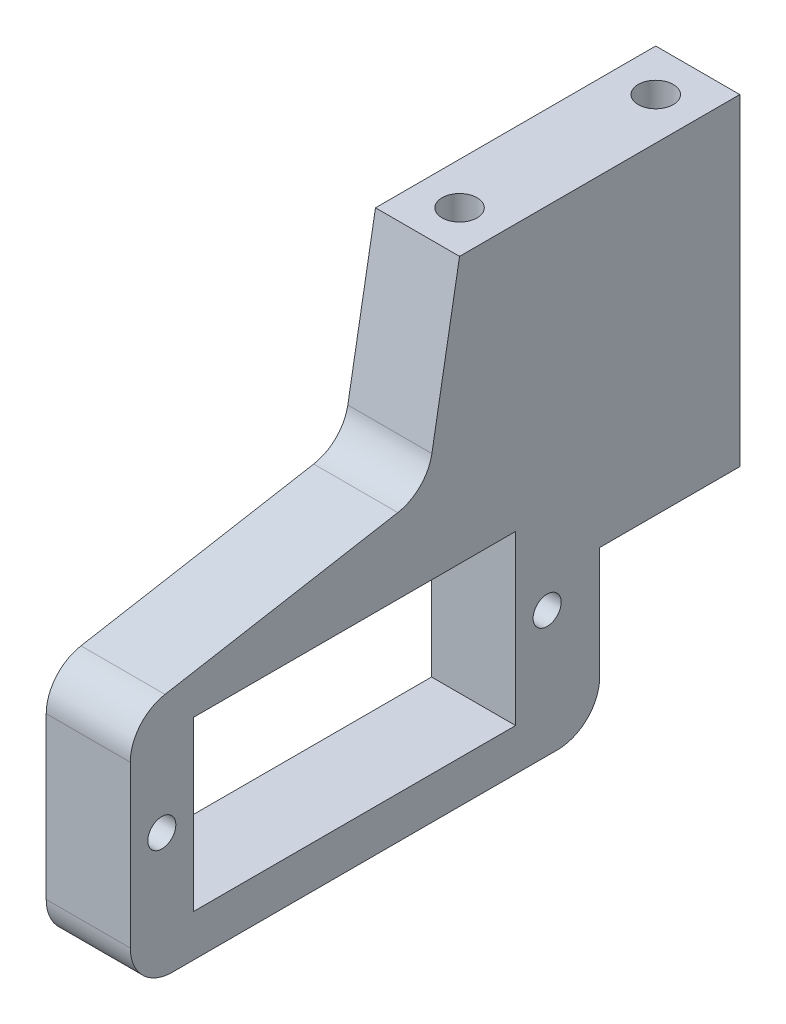
ISO-10303-21;
HEADER;
FILE_DESCRIPTION(('STEP AP214'),'2;1');
FILE_NAME('part.step','',(''),(''),'','','');
FILE_SCHEMA(('AUTOMOTIVE_DESIGN { 1 0 10303 214 1 1 1 1 }'));
ENDSEC;
DATA;
#1=APPLICATION_CONTEXT('core data for automotive mechanical design processes');
#2=APPLICATION_PROTOCOL_DEFINITION('international standard','automotive_design',2000,#1);
#3=PRODUCT_CONTEXT('',#1,'mechanical');
#4=PRODUCT('Part','Part','',(#3));
#5=PRODUCT_RELATED_PRODUCT_CATEGORY('part','',(#4));
#6=PRODUCT_DEFINITION_FORMATION('','',#4);
#7=PRODUCT_DEFINITION_CONTEXT('part definition',#1,'design');
#8=PRODUCT_DEFINITION('design','',#6,#7);
#9=PRODUCT_DEFINITION_SHAPE('','',#8);
#10=(LENGTH_UNIT() NAMED_UNIT(*) SI_UNIT(.MILLI.,.METRE.));
#11=(NAMED_UNIT(*) PLANE_ANGLE_UNIT() SI_UNIT($,.RADIAN.));
#12=(NAMED_UNIT(*) SI_UNIT($,.STERADIAN.) SOLID_ANGLE_UNIT());
#13=UNCERTAINTY_MEASURE_WITH_UNIT(LENGTH_MEASURE(1.E-05),#10,'distance_accuracy_value','');
#14=(GEOMETRIC_REPRESENTATION_CONTEXT(3) GLOBAL_UNCERTAINTY_ASSIGNED_CONTEXT((#13)) GLOBAL_UNIT_ASSIGNED_CONTEXT((#10,
#11,#12)) REPRESENTATION_CONTEXT('',''));
#15=CARTESIAN_POINT('',(0.,0.,0.));
#16=DIRECTION('',(0.,0.,1.));
#17=DIRECTION('',(1.,0.,0.));
#18=AXIS2_PLACEMENT_3D('',#15,#16,#17);
#19=CARTESIAN_POINT('',(6.,0.,0.));
#20=DIRECTION('',(1.,0.,0.));
#21=DIRECTION('',(0.,0.,-1.));
#22=AXIS2_PLACEMENT_3D('',#19,#20,#21);
#23=PLANE('',#22);
#24=DIRECTION('',(0.,0.,-1.));
#25=VECTOR('',#24,1.);
#26=CARTESIAN_POINT('',(6.,-34.,43.5));
#27=LINE('',#26,#25);
#28=CARTESIAN_POINT('',(6.,-34.,40.5));
#29=VERTEX_POINT('',#28);
#30=CARTESIAN_POINT('',(6.,-34.,13.));
#31=VERTEX_POINT('',#30);
#32=EDGE_CURVE('E251',#29,#31,#27,.T.);
#33=ORIENTED_EDGE('',*,*,#32,.T.);
#34=CARTESIAN_POINT('',(6.,-31.,13.));
#35=DIRECTION('',(1.,0.,0.));
#36=DIRECTION('',(0.,0.,-1.));
#37=AXIS2_PLACEMENT_3D('',#34,#35,#36);
#38=CIRCLE('',#37,3.);
#39=CARTESIAN_POINT('',(6.,-31.,10.));
#40=VERTEX_POINT('',#39);
#41=EDGE_CURVE('E300',#31,#40,#38,.T.);
#42=ORIENTED_EDGE('',*,*,#41,.T.);
#43=DIRECTION('',(0.,1.,0.));
#44=VECTOR('',#43,1.);
#45=CARTESIAN_POINT('',(6.,-34.,10.));
#46=LINE('',#45,#44);
#47=CARTESIAN_POINT('',(6.,-23.,10.));
#48=VERTEX_POINT('',#47);
#49=EDGE_CURVE('E181',#40,#48,#46,.T.);
#50=ORIENTED_EDGE('',*,*,#49,.T.);
#51=DIRECTION('',(0.,0.,-1.));
#52=VECTOR('',#51,1.);
#53=CARTESIAN_POINT('',(6.,-23.,0.));
#54=LINE('',#53,#52);
#55=CARTESIAN_POINT('',(6.,-23.,0.));
#56=VERTEX_POINT('',#55);
#57=EDGE_CURVE('E183',#48,#56,#54,.T.);
#58=ORIENTED_EDGE('',*,*,#57,.T.);
#59=DIRECTION('',(0.,1.,0.));
#60=VECTOR('',#59,1.);
#61=CARTESIAN_POINT('',(6.,-34.,0.));
#62=LINE('',#61,#60);
#63=CARTESIAN_POINT('',(6.,0.,0.));
#64=VERTEX_POINT('',#63);
#65=EDGE_CURVE('E254',#56,#64,#62,.T.);
#66=ORIENTED_EDGE('',*,*,#65,.T.);
#67=DIRECTION('',(0.,0.,1.));
#68=VECTOR('',#67,1.);
#69=CARTESIAN_POINT('',(6.,0.,0.));
#70=LINE('',#69,#68);
#71=CARTESIAN_POINT('',(6.,0.,20.));
#72=VERTEX_POINT('',#71);
#73=EDGE_CURVE('E240',#64,#72,#70,.T.);
#74=ORIENTED_EDGE('',*,*,#73,.T.);
#75=DIRECTION('',(0.,-0.984807753012209,0.173648177666926));
#76=VECTOR('',#75,1.);
#77=CARTESIAN_POINT('',(6.,0.,20.));
#78=LINE('',#77,#76);
#79=CARTESIAN_POINT('',(6.,-11.2001513763779,21.9748888756744));
#80=VERTEX_POINT('',#79);
#81=EDGE_CURVE('E243',#72,#80,#78,.T.);
#82=ORIENTED_EDGE('',*,*,#81,.T.);
#83=CARTESIAN_POINT('',(6.,-10.6792068433771,24.9293121347111));
#84=DIRECTION('',(1.,0.,0.));
#85=DIRECTION('',(0.,0.,-1.));
#86=AXIS2_PLACEMENT_3D('',#83,#84,#85);
#87=CIRCLE('',#86,3.);
#88=CARTESIAN_POINT('',(6.,-13.6336301024137,24.4083676017103));
#89=VERTEX_POINT('',#88);
#90=EDGE_CURVE('E11',#80,#89,#87,.F.);
#91=ORIENTED_EDGE('',*,*,#90,.T.);
#92=DIRECTION('',(0.,-0.173648177666927,0.984807753012209));
#93=VECTOR('',#92,1.);
#94=CARTESIAN_POINT('',(6.,-13.2688608134174,22.3396581646707));
#95=LINE('',#94,#93);
#96=CARTESIAN_POINT('',(6.,-16.5628756344952,41.0209445330008));
#97=VERTEX_POINT('',#96);
#98=EDGE_CURVE('E247',#89,#97,#95,.T.);
#99=ORIENTED_EDGE('',*,*,#98,.T.);
#100=CARTESIAN_POINT('',(6.,-19.5172988935318,40.5));
#101=DIRECTION('',(1.,0.,0.));
#102=DIRECTION('',(0.,0.,-1.));
#103=AXIS2_PLACEMENT_3D('',#100,#101,#102);
#104=CIRCLE('',#103,3.);
#105=CARTESIAN_POINT('',(6.,-19.5172988935318,43.5));
#106=VERTEX_POINT('',#105);
#107=EDGE_CURVE('E55',#97,#106,#104,.T.);
#108=ORIENTED_EDGE('',*,*,#107,.T.);
#109=DIRECTION('',(0.,-1.,0.));
#110=VECTOR('',#109,1.);
#111=CARTESIAN_POINT('',(6.,-17.,43.5));
#112=LINE('',#111,#110);
#113=CARTESIAN_POINT('',(6.,-31.,43.5));
#114=VERTEX_POINT('',#113);
#115=EDGE_CURVE('E249',#106,#114,#112,.T.);
#116=ORIENTED_EDGE('',*,*,#115,.T.);
#117=CARTESIAN_POINT('',(6.,-31.,40.5));
#118=DIRECTION('',(1.,0.,0.));
#119=DIRECTION('',(0.,0.,-1.));
#120=AXIS2_PLACEMENT_3D('',#117,#118,#119);
#121=CIRCLE('',#120,3.);
#122=EDGE_CURVE('E298',#114,#29,#121,.T.);
#123=ORIENTED_EDGE('',*,*,#122,.T.);
#124=EDGE_LOOP('',(#33,#42,#50,#58,#66,#74,#82,#91,#99,#108,#116,#123));
#125=FACE_BOUND('',#124,.T.);
#126=CARTESIAN_POINT('',(6.,-25.,13.75));
#127=DIRECTION('',(1.,0.,0.));
#128=DIRECTION('',(0.,0.,1.));
#129=AXIS2_PLACEMENT_3D('',#126,#127,#128);
#130=CIRCLE('',#129,1.);
#131=CARTESIAN_POINT('',(6.,-25.,14.75));
#132=VERTEX_POINT('',#131);
#133=EDGE_CURVE('E228',#132,#132,#130,.T.);
#134=ORIENTED_EDGE('',*,*,#133,.F.);
#135=EDGE_LOOP('',(#134));
#136=FACE_BOUND('',#135,.T.);
#137=CARTESIAN_POINT('',(6.,-25.,41.25));
#138=DIRECTION('',(1.,0.,0.));
#139=DIRECTION('',(0.,0.,1.));
#140=AXIS2_PLACEMENT_3D('',#137,#138,#139);
#141=CIRCLE('',#140,0.999999999999998);
#142=CARTESIAN_POINT('',(6.,-25.,42.25));
#143=VERTEX_POINT('',#142);
#144=EDGE_CURVE('E234',#143,#143,#141,.T.);
#145=ORIENTED_EDGE('',*,*,#144,.F.);
#146=EDGE_LOOP('',(#145));
#147=FACE_BOUND('',#146,.T.);
#148=DIRECTION('',(0.,0.,1.));
#149=VECTOR('',#148,1.);
#150=CARTESIAN_POINT('',(6.,-19.,39.));
#151=LINE('',#150,#149);
#152=CARTESIAN_POINT('',(6.,-19.,16.));
#153=VERTEX_POINT('',#152);
#154=CARTESIAN_POINT('',(6.,-19.,39.));
#155=VERTEX_POINT('',#154);
#156=EDGE_CURVE('E199',#153,#155,#151,.T.);
#157=ORIENTED_EDGE('',*,*,#156,.F.);
#158=DIRECTION('',(0.,1.,0.));
#159=VECTOR('',#158,1.);
#160=CARTESIAN_POINT('',(6.,-19.,16.));
#161=LINE('',#160,#159);
#162=CARTESIAN_POINT('',(6.,-31.,16.));
#163=VERTEX_POINT('',#162);
#164=EDGE_CURVE('E197',#163,#153,#161,.T.);
#165=ORIENTED_EDGE('',*,*,#164,.F.);
#166=DIRECTION('',(0.,0.,-1.));
#167=VECTOR('',#166,1.);
#168=CARTESIAN_POINT('',(6.,-31.,16.));
#169=LINE('',#168,#167);
#170=CARTESIAN_POINT('',(6.,-31.,39.));
#171=VERTEX_POINT('',#170);
#172=EDGE_CURVE('E205',#171,#163,#169,.T.);
#173=ORIENTED_EDGE('',*,*,#172,.F.);
#174=DIRECTION('',(0.,-1.,0.));
#175=VECTOR('',#174,1.);
#176=CARTESIAN_POINT('',(6.,-31.,39.));
#177=LINE('',#176,#175);
#178=EDGE_CURVE('E202',#155,#171,#177,.T.);
#179=ORIENTED_EDGE('',*,*,#178,.F.);
#180=EDGE_LOOP('',(#157,#165,#173,#179));
#181=FACE_BOUND('',#180,.T.);
#182=ADVANCED_FACE('F33',(#125,#136,#147,#181),#23,.T.);
#183=CARTESIAN_POINT('',(0.,0.,0.));
#184=DIRECTION('',(1.,0.,0.));
#185=DIRECTION('',(0.,0.,-1.));
#186=AXIS2_PLACEMENT_3D('',#183,#184,#185);
#187=PLANE('',#186);
#188=CARTESIAN_POINT('',(0.,-25.,13.75));
#189=DIRECTION('',(1.,0.,0.));
#190=DIRECTION('',(0.,0.,1.));
#191=AXIS2_PLACEMENT_3D('',#188,#189,#190);
#192=CIRCLE('',#191,1.);
#193=CARTESIAN_POINT('',(0.,-25.,14.75));
#194=VERTEX_POINT('',#193);
#195=EDGE_CURVE('E227',#194,#194,#192,.T.);
#196=ORIENTED_EDGE('',*,*,#195,.T.);
#197=EDGE_LOOP('',(#196));
#198=FACE_BOUND('',#197,.T.);
#199=DIRECTION('',(0.,1.,0.));
#200=VECTOR('',#199,1.);
#201=CARTESIAN_POINT('',(0.,-34.,10.));
#202=LINE('',#201,#200);
#203=CARTESIAN_POINT('',(0.,-31.,10.));
#204=VERTEX_POINT('',#203);
#205=CARTESIAN_POINT('',(0.,-23.,10.));
#206=VERTEX_POINT('',#205);
#207=EDGE_CURVE('E186',#204,#206,#202,.T.);
#208=ORIENTED_EDGE('',*,*,#207,.F.);
#209=CARTESIAN_POINT('',(0.,-31.,13.));
#210=DIRECTION('',(1.,0.,0.));
#211=DIRECTION('',(0.,0.,-1.));
#212=AXIS2_PLACEMENT_3D('',#209,#210,#211);
#213=CIRCLE('',#212,3.);
#214=CARTESIAN_POINT('',(0.,-34.,13.));
#215=VERTEX_POINT('',#214);
#216=EDGE_CURVE('E290',#204,#215,#213,.F.);
#217=ORIENTED_EDGE('',*,*,#216,.T.);
#218=DIRECTION('',(0.,0.,-1.));
#219=VECTOR('',#218,1.);
#220=CARTESIAN_POINT('',(0.,-34.,43.5));
#221=LINE('',#220,#219);
#222=CARTESIAN_POINT('',(0.,-34.,40.5));
#223=VERTEX_POINT('',#222);
#224=EDGE_CURVE('E267',#223,#215,#221,.T.);
#225=ORIENTED_EDGE('',*,*,#224,.F.);
#226=CARTESIAN_POINT('',(0.,-31.,40.5));
#227=DIRECTION('',(1.,0.,0.));
#228=DIRECTION('',(0.,0.,-1.));
#229=AXIS2_PLACEMENT_3D('',#226,#227,#228);
#230=CIRCLE('',#229,3.);
#231=CARTESIAN_POINT('',(0.,-31.,43.5));
#232=VERTEX_POINT('',#231);
#233=EDGE_CURVE('E288',#223,#232,#230,.F.);
#234=ORIENTED_EDGE('',*,*,#233,.T.);
#235=DIRECTION('',(0.,-1.,0.));
#236=VECTOR('',#235,1.);
#237=CARTESIAN_POINT('',(0.,-17.,43.5));
#238=LINE('',#237,#236);
#239=CARTESIAN_POINT('',(0.,-19.5172988935318,43.5));
#240=VERTEX_POINT('',#239);
#241=EDGE_CURVE('E265',#240,#232,#238,.T.);
#242=ORIENTED_EDGE('',*,*,#241,.F.);
#243=CARTESIAN_POINT('',(0.,-19.5172988935318,40.5));
#244=DIRECTION('',(1.,0.,0.));
#245=DIRECTION('',(0.,0.,-1.));
#246=AXIS2_PLACEMENT_3D('',#243,#244,#245);
#247=CIRCLE('',#246,3.);
#248=CARTESIAN_POINT('',(0.,-16.5628756344952,41.0209445330008));
#249=VERTEX_POINT('',#248);
#250=EDGE_CURVE('E286',#240,#249,#247,.F.);
#251=ORIENTED_EDGE('',*,*,#250,.T.);
#252=DIRECTION('',(0.,-0.173648177666927,0.984807753012209));
#253=VECTOR('',#252,1.);
#254=CARTESIAN_POINT('',(0.,-13.2688608134174,22.3396581646707));
#255=LINE('',#254,#253);
#256=CARTESIAN_POINT('',(0.,-13.6336301024137,24.4083676017103));
#257=VERTEX_POINT('',#256);
#258=EDGE_CURVE('E262',#257,#249,#255,.T.);
#259=ORIENTED_EDGE('',*,*,#258,.F.);
#260=CARTESIAN_POINT('',(0.,-10.6792068433771,24.9293121347111));
#261=DIRECTION('',(1.,0.,0.));
#262=DIRECTION('',(0.,0.,-1.));
#263=AXIS2_PLACEMENT_3D('',#260,#261,#262);
#264=CIRCLE('',#263,3.);
#265=CARTESIAN_POINT('',(0.,-11.2001513763779,21.9748888756744));
#266=VERTEX_POINT('',#265);
#267=EDGE_CURVE('E41',#257,#266,#264,.T.);
#268=ORIENTED_EDGE('',*,*,#267,.T.);
#269=DIRECTION('',(0.,-0.984807753012209,0.173648177666926));
#270=VECTOR('',#269,1.);
#271=CARTESIAN_POINT('',(0.,0.,20.));
#272=LINE('',#271,#270);
#273=CARTESIAN_POINT('',(0.,0.,20.));
#274=VERTEX_POINT('',#273);
#275=EDGE_CURVE('E259',#274,#266,#272,.T.);
#276=ORIENTED_EDGE('',*,*,#275,.F.);
#277=DIRECTION('',(0.,0.,1.));
#278=VECTOR('',#277,1.);
#279=CARTESIAN_POINT('',(0.,0.,0.));
#280=LINE('',#279,#278);
#281=CARTESIAN_POINT('',(0.,0.,0.));
#282=VERTEX_POINT('',#281);
#283=EDGE_CURVE('E237',#282,#274,#280,.T.);
#284=ORIENTED_EDGE('',*,*,#283,.F.);
#285=DIRECTION('',(0.,1.,0.));
#286=VECTOR('',#285,1.);
#287=CARTESIAN_POINT('',(0.,-34.,0.));
#288=LINE('',#287,#286);
#289=CARTESIAN_POINT('',(0.,-23.,0.));
#290=VERTEX_POINT('',#289);
#291=EDGE_CURVE('E244',#290,#282,#288,.T.);
#292=ORIENTED_EDGE('',*,*,#291,.F.);
#293=DIRECTION('',(0.,0.,-1.));
#294=VECTOR('',#293,1.);
#295=CARTESIAN_POINT('',(0.,-23.,0.));
#296=LINE('',#295,#294);
#297=EDGE_CURVE('E188',#206,#290,#296,.T.);
#298=ORIENTED_EDGE('',*,*,#297,.F.);
#299=EDGE_LOOP('',(#208,#217,#225,#234,#242,#251,#259,#268,#276,#284,#292,#298));
#300=FACE_BOUND('',#299,.T.);
#301=CARTESIAN_POINT('',(0.,-25.,41.25));
#302=DIRECTION('',(1.,0.,0.));
#303=DIRECTION('',(0.,0.,1.));
#304=AXIS2_PLACEMENT_3D('',#301,#302,#303);
#305=CIRCLE('',#304,0.999999999999998);
#306=CARTESIAN_POINT('',(0.,-25.,42.25));
#307=VERTEX_POINT('',#306);
#308=EDGE_CURVE('E231',#307,#307,#305,.T.);
#309=ORIENTED_EDGE('',*,*,#308,.T.);
#310=EDGE_LOOP('',(#309));
#311=FACE_BOUND('',#310,.T.);
#312=DIRECTION('',(0.,1.,0.));
#313=VECTOR('',#312,1.);
#314=CARTESIAN_POINT('',(0.,-19.,16.));
#315=LINE('',#314,#313);
#316=CARTESIAN_POINT('',(0.,-31.,16.));
#317=VERTEX_POINT('',#316);
#318=CARTESIAN_POINT('',(0.,-19.,16.));
#319=VERTEX_POINT('',#318);
#320=EDGE_CURVE('E194',#317,#319,#315,.T.);
#321=ORIENTED_EDGE('',*,*,#320,.T.);
#322=DIRECTION('',(0.,0.,1.));
#323=VECTOR('',#322,1.);
#324=CARTESIAN_POINT('',(0.,-19.,39.));
#325=LINE('',#324,#323);
#326=CARTESIAN_POINT('',(0.,-19.,39.));
#327=VERTEX_POINT('',#326);
#328=EDGE_CURVE('E210',#319,#327,#325,.T.);
#329=ORIENTED_EDGE('',*,*,#328,.T.);
#330=DIRECTION('',(0.,-1.,0.));
#331=VECTOR('',#330,1.);
#332=CARTESIAN_POINT('',(0.,-31.,39.));
#333=LINE('',#332,#331);
#334=CARTESIAN_POINT('',(0.,-31.,39.));
#335=VERTEX_POINT('',#334);
#336=EDGE_CURVE('E213',#327,#335,#333,.T.);
#337=ORIENTED_EDGE('',*,*,#336,.T.);
#338=DIRECTION('',(0.,0.,-1.));
#339=VECTOR('',#338,1.);
#340=CARTESIAN_POINT('',(0.,-31.,16.));
#341=LINE('',#340,#339);
#342=EDGE_CURVE('E200',#335,#317,#341,.T.);
#343=ORIENTED_EDGE('',*,*,#342,.T.);
#344=EDGE_LOOP('',(#321,#329,#337,#343));
#345=FACE_BOUND('',#344,.T.);
#346=ADVANCED_FACE('F308',(#198,#300,#311,#345),#187,.F.);
#347=CARTESIAN_POINT('',(6.,0.,0.));
#348=DIRECTION('',(0.,-1.,0.));
#349=DIRECTION('',(0.,0.,-1.));
#350=AXIS2_PLACEMENT_3D('',#347,#348,#349);
#351=PLANE('',#350);
#352=CARTESIAN_POINT('',(3.,0.,3.));
#353=DIRECTION('',(0.,1.,0.));
#354=DIRECTION('',(0.,0.,1.));
#355=AXIS2_PLACEMENT_3D('',#352,#353,#354);
#356=CIRCLE('',#355,1.24999999999999);
#357=CARTESIAN_POINT('',(3.,0.,4.24999999999999));
#358=VERTEX_POINT('',#357);
#359=EDGE_CURVE('E165',#358,#358,#356,.T.);
#360=ORIENTED_EDGE('',*,*,#359,.F.);
#361=EDGE_LOOP('',(#360));
#362=FACE_BOUND('',#361,.T.);
#363=CARTESIAN_POINT('',(3.,0.,17.));
#364=DIRECTION('',(0.,1.,0.));
#365=DIRECTION('',(0.,0.,1.));
#366=AXIS2_PLACEMENT_3D('',#363,#364,#365);
#367=CIRCLE('',#366,1.24999999999999);
#368=CARTESIAN_POINT('',(3.,0.,18.25));
#369=VERTEX_POINT('',#368);
#370=EDGE_CURVE('E164',#369,#369,#367,.T.);
#371=ORIENTED_EDGE('',*,*,#370,.F.);
#372=EDGE_LOOP('',(#371));
#373=FACE_BOUND('',#372,.T.);
#374=ORIENTED_EDGE('',*,*,#283,.T.);
#375=DIRECTION('',(-1.,0.,0.));
#376=VECTOR('',#375,1.);
#377=CARTESIAN_POINT('',(6.,0.,20.));
#378=LINE('',#377,#376);
#379=EDGE_CURVE('E273',#72,#274,#378,.T.);
#380=ORIENTED_EDGE('',*,*,#379,.F.);
#381=ORIENTED_EDGE('',*,*,#73,.F.);
#382=DIRECTION('',(-1.,0.,0.));
#383=VECTOR('',#382,1.);
#384=CARTESIAN_POINT('',(6.,0.,0.));
#385=LINE('',#384,#383);
#386=EDGE_CURVE('E256',#64,#282,#385,.T.);
#387=ORIENTED_EDGE('',*,*,#386,.T.);
#388=EDGE_LOOP('',(#374,#380,#381,#387));
#389=FACE_BOUND('',#388,.T.);
#390=ADVANCED_FACE('F356',(#362,#373,#389),#351,.F.);
#391=CARTESIAN_POINT('',(6.,0.,20.));
#392=DIRECTION('',(0.,-0.173648177666926,-0.984807753012209));
#393=DIRECTION('',(0.,0.984807753012209,-0.173648177666926));
#394=AXIS2_PLACEMENT_3D('',#391,#392,#393);
#395=PLANE('',#394);
#396=ORIENTED_EDGE('',*,*,#275,.T.);
#397=DIRECTION('',(-1.,0.,0.));
#398=VECTOR('',#397,1.);
#399=CARTESIAN_POINT('',(6.,-11.2001513763779,21.9748888756744));
#400=LINE('',#399,#398);
#401=EDGE_CURVE('E281',#266,#80,#400,.F.);
#402=ORIENTED_EDGE('',*,*,#401,.T.);
#403=ORIENTED_EDGE('',*,*,#81,.F.);
#404=ORIENTED_EDGE('',*,*,#379,.T.);
#405=EDGE_LOOP('',(#396,#402,#403,#404));
#406=FACE_BOUND('',#405,.T.);
#407=ADVANCED_FACE('F315',(#406),#395,.F.);
#408=CARTESIAN_POINT('',(6.,-13.2688608134174,22.3396581646707));
#409=DIRECTION('',(0.,-0.984807753012208,-0.173648177666927));
#410=DIRECTION('',(0.,0.173648177666927,-0.984807753012209));
#411=AXIS2_PLACEMENT_3D('',#408,#409,#410);
#412=PLANE('',#411);
#413=ORIENTED_EDGE('',*,*,#98,.F.);
#414=DIRECTION('',(-1.,0.,0.));
#415=VECTOR('',#414,1.);
#416=CARTESIAN_POINT('',(0.,-13.6336301024137,24.4083676017103));
#417=LINE('',#416,#415);
#418=EDGE_CURVE('E278',#89,#257,#417,.T.);
#419=ORIENTED_EDGE('',*,*,#418,.T.);
#420=ORIENTED_EDGE('',*,*,#258,.T.);
#421=DIRECTION('',(-1.,0.,0.));
#422=VECTOR('',#421,1.);
#423=CARTESIAN_POINT('',(6.,-16.5628756344952,41.0209445330008));
#424=LINE('',#423,#422);
#425=EDGE_CURVE('E276',#249,#97,#424,.F.);
#426=ORIENTED_EDGE('',*,*,#425,.T.);
#427=EDGE_LOOP('',(#413,#419,#420,#426));
#428=FACE_BOUND('',#427,.T.);
#429=ADVANCED_FACE('F322',(#428),#412,.F.);
#430=CARTESIAN_POINT('',(6.,-17.,43.5));
#431=DIRECTION('',(0.,0.,-1.));
#432=DIRECTION('',(-1.,0.,0.));
#433=AXIS2_PLACEMENT_3D('',#430,#431,#432);
#434=PLANE('',#433);
#435=ORIENTED_EDGE('',*,*,#241,.T.);
#436=DIRECTION('',(-1.,0.,0.));
#437=VECTOR('',#436,1.);
#438=CARTESIAN_POINT('',(6.,-31.,43.5));
#439=LINE('',#438,#437);
#440=EDGE_CURVE('E48',#232,#114,#439,.F.);
#441=ORIENTED_EDGE('',*,*,#440,.T.);
#442=ORIENTED_EDGE('',*,*,#115,.F.);
#443=DIRECTION('',(-1.,0.,0.));
#444=VECTOR('',#443,1.);
#445=CARTESIAN_POINT('',(6.,-19.5172988935318,43.5));
#446=LINE('',#445,#444);
#447=EDGE_CURVE('E302',#106,#240,#446,.T.);
#448=ORIENTED_EDGE('',*,*,#447,.T.);
#449=EDGE_LOOP('',(#435,#441,#442,#448));
#450=FACE_BOUND('',#449,.T.);
#451=ADVANCED_FACE('F327',(#450),#434,.F.);
#452=CARTESIAN_POINT('',(6.,-34.,43.5));
#453=DIRECTION('',(0.,1.,0.));
#454=DIRECTION('',(0.,0.,1.));
#455=AXIS2_PLACEMENT_3D('',#452,#453,#454);
#456=PLANE('',#455);
#457=ORIENTED_EDGE('',*,*,#224,.T.);
#458=DIRECTION('',(-1.,0.,0.));
#459=VECTOR('',#458,1.);
#460=CARTESIAN_POINT('',(6.,-34.,13.));
#461=LINE('',#460,#459);
#462=EDGE_CURVE('E295',#215,#31,#461,.F.);
#463=ORIENTED_EDGE('',*,*,#462,.T.);
#464=ORIENTED_EDGE('',*,*,#32,.F.);
#465=DIRECTION('',(-1.,0.,0.));
#466=VECTOR('',#465,1.);
#467=CARTESIAN_POINT('',(6.,-34.,40.5));
#468=LINE('',#467,#466);
#469=EDGE_CURVE('E292',#29,#223,#468,.T.);
#470=ORIENTED_EDGE('',*,*,#469,.T.);
#471=EDGE_LOOP('',(#457,#463,#464,#470));
#472=FACE_BOUND('',#471,.T.);
#473=ADVANCED_FACE('F335',(#472),#456,.F.);
#474=CARTESIAN_POINT('',(6.,-34.,0.));
#475=DIRECTION('',(0.,0.,1.));
#476=DIRECTION('',(1.,0.,0.));
#477=AXIS2_PLACEMENT_3D('',#474,#475,#476);
#478=PLANE('',#477);
#479=ORIENTED_EDGE('',*,*,#65,.F.);
#480=DIRECTION('',(-1.,0.,0.));
#481=VECTOR('',#480,1.);
#482=CARTESIAN_POINT('',(6.001,-23.,0.));
#483=LINE('',#482,#481);
#484=EDGE_CURVE('E191',#56,#290,#483,.T.);
#485=ORIENTED_EDGE('',*,*,#484,.T.);
#486=ORIENTED_EDGE('',*,*,#291,.T.);
#487=ORIENTED_EDGE('',*,*,#386,.F.);
#488=EDGE_LOOP('',(#479,#485,#486,#487));
#489=FACE_BOUND('',#488,.T.);
#490=ADVANCED_FACE('F352',(#489),#478,.F.);
#491=CARTESIAN_POINT('',(6.,-25.,41.25));
#492=DIRECTION('',(-1.,0.,0.));
#493=DIRECTION('',(0.,0.,1.));
#494=AXIS2_PLACEMENT_3D('',#491,#492,#493);
#495=CYLINDRICAL_SURFACE('',#494,0.999999999999998);
#496=ORIENTED_EDGE('',*,*,#144,.T.);
#497=EDGE_LOOP('',(#496));
#498=FACE_BOUND('',#497,.T.);
#499=ORIENTED_EDGE('',*,*,#308,.F.);
#500=EDGE_LOOP('',(#499));
#501=FACE_BOUND('',#500,.T.);
#502=ADVANCED_FACE('F375',(#498,#501),#495,.F.);
#503=CARTESIAN_POINT('',(6.,-25.,13.75));
#504=DIRECTION('',(-1.,0.,0.));
#505=DIRECTION('',(0.,0.,1.));
#506=AXIS2_PLACEMENT_3D('',#503,#504,#505);
#507=CYLINDRICAL_SURFACE('',#506,1.);
#508=ORIENTED_EDGE('',*,*,#133,.T.);
#509=EDGE_LOOP('',(#508));
#510=FACE_BOUND('',#509,.T.);
#511=ORIENTED_EDGE('',*,*,#195,.F.);
#512=EDGE_LOOP('',(#511));
#513=FACE_BOUND('',#512,.T.);
#514=ADVANCED_FACE('F409',(#510,#513),#507,.F.);
#515=CARTESIAN_POINT('',(6.,-19.,16.));
#516=DIRECTION('',(0.,0.,1.));
#517=DIRECTION('',(1.,0.,0.));
#518=AXIS2_PLACEMENT_3D('',#515,#516,#517);
#519=PLANE('',#518);
#520=ORIENTED_EDGE('',*,*,#320,.F.);
#521=DIRECTION('',(-1.,0.,0.));
#522=VECTOR('',#521,1.);
#523=CARTESIAN_POINT('',(6.,-31.,16.));
#524=LINE('',#523,#522);
#525=EDGE_CURVE('E207',#163,#317,#524,.T.);
#526=ORIENTED_EDGE('',*,*,#525,.F.);
#527=ORIENTED_EDGE('',*,*,#164,.T.);
#528=DIRECTION('',(-1.,0.,0.));
#529=VECTOR('',#528,1.);
#530=CARTESIAN_POINT('',(6.,-19.,16.));
#531=LINE('',#530,#529);
#532=EDGE_CURVE('E224',#153,#319,#531,.T.);
#533=ORIENTED_EDGE('',*,*,#532,.T.);
#534=EDGE_LOOP('',(#520,#526,#527,#533));
#535=FACE_BOUND('',#534,.T.);
#536=ADVANCED_FACE('F416',(#535),#519,.T.);
#537=CARTESIAN_POINT('',(6.,-19.,39.));
#538=DIRECTION('',(0.,-1.,0.));
#539=DIRECTION('',(0.,0.,-1.));
#540=AXIS2_PLACEMENT_3D('',#537,#538,#539);
#541=PLANE('',#540);
#542=ORIENTED_EDGE('',*,*,#328,.F.);
#543=ORIENTED_EDGE('',*,*,#532,.F.);
#544=ORIENTED_EDGE('',*,*,#156,.T.);
#545=DIRECTION('',(-1.,0.,0.));
#546=VECTOR('',#545,1.);
#547=CARTESIAN_POINT('',(6.,-19.,39.));
#548=LINE('',#547,#546);
#549=EDGE_CURVE('E222',#155,#327,#548,.T.);
#550=ORIENTED_EDGE('',*,*,#549,.T.);
#551=EDGE_LOOP('',(#542,#543,#544,#550));
#552=FACE_BOUND('',#551,.T.);
#553=ADVANCED_FACE('F423',(#552),#541,.T.);
#554=CARTESIAN_POINT('',(6.,-31.,39.));
#555=DIRECTION('',(0.,0.,-1.));
#556=DIRECTION('',(-1.,0.,0.));
#557=AXIS2_PLACEMENT_3D('',#554,#555,#556);
#558=PLANE('',#557);
#559=ORIENTED_EDGE('',*,*,#336,.F.);
#560=ORIENTED_EDGE('',*,*,#549,.F.);
#561=ORIENTED_EDGE('',*,*,#178,.T.);
#562=DIRECTION('',(-1.,0.,0.));
#563=VECTOR('',#562,1.);
#564=CARTESIAN_POINT('',(6.,-31.,39.));
#565=LINE('',#564,#563);
#566=EDGE_CURVE('E220',#171,#335,#565,.T.);
#567=ORIENTED_EDGE('',*,*,#566,.T.);
#568=EDGE_LOOP('',(#559,#560,#561,#567));
#569=FACE_BOUND('',#568,.T.);
#570=ADVANCED_FACE('F431',(#569),#558,.T.);
#571=CARTESIAN_POINT('',(6.,-31.,16.));
#572=DIRECTION('',(0.,1.,0.));
#573=DIRECTION('',(0.,0.,1.));
#574=AXIS2_PLACEMENT_3D('',#571,#572,#573);
#575=PLANE('',#574);
#576=ORIENTED_EDGE('',*,*,#342,.F.);
#577=ORIENTED_EDGE('',*,*,#566,.F.);
#578=ORIENTED_EDGE('',*,*,#172,.T.);
#579=ORIENTED_EDGE('',*,*,#525,.T.);
#580=EDGE_LOOP('',(#576,#577,#578,#579));
#581=FACE_BOUND('',#580,.T.);
#582=ADVANCED_FACE('F439',(#581),#575,.T.);
#583=CARTESIAN_POINT('',(6.001,-23.,0.));
#584=DIRECTION('',(0.,1.,0.));
#585=DIRECTION('',(0.,0.,1.));
#586=AXIS2_PLACEMENT_3D('',#583,#584,#585);
#587=PLANE('',#586);
#588=CARTESIAN_POINT('',(3.,-23.,5.));
#589=DIRECTION('',(0.,-1.,0.));
#590=DIRECTION('',(0.,0.,-1.));
#591=AXIS2_PLACEMENT_3D('',#588,#589,#590);
#592=CIRCLE('',#591,1.24999999999999);
#593=CARTESIAN_POINT('',(3.,-23.,3.75000000000001));
#594=VERTEX_POINT('',#593);
#595=EDGE_CURVE('E175',#594,#594,#592,.T.);
#596=ORIENTED_EDGE('',*,*,#595,.F.);
#597=EDGE_LOOP('',(#596));
#598=FACE_BOUND('',#597,.T.);
#599=DIRECTION('',(-1.,0.,0.));
#600=VECTOR('',#599,1.);
#601=CARTESIAN_POINT('',(6.001,-23.,10.));
#602=LINE('',#601,#600);
#603=EDGE_CURVE('E190',#48,#206,#602,.T.);
#604=ORIENTED_EDGE('',*,*,#603,.T.);
#605=ORIENTED_EDGE('',*,*,#297,.T.);
#606=ORIENTED_EDGE('',*,*,#484,.F.);
#607=ORIENTED_EDGE('',*,*,#57,.F.);
#608=EDGE_LOOP('',(#604,#605,#606,#607));
#609=FACE_BOUND('',#608,.T.);
#610=ADVANCED_FACE('F348',(#598,#609),#587,.F.);
#611=CARTESIAN_POINT('',(6.001,-34.,10.));
#612=DIRECTION('',(0.,0.,1.));
#613=DIRECTION('',(1.,0.,0.));
#614=AXIS2_PLACEMENT_3D('',#611,#612,#613);
#615=PLANE('',#614);
#616=ORIENTED_EDGE('',*,*,#49,.F.);
#617=DIRECTION('',(-1.,0.,0.));
#618=VECTOR('',#617,1.);
#619=CARTESIAN_POINT('',(6.001,-31.,10.));
#620=LINE('',#619,#618);
#621=EDGE_CURVE('E283',#40,#204,#620,.T.);
#622=ORIENTED_EDGE('',*,*,#621,.T.);
#623=ORIENTED_EDGE('',*,*,#207,.T.);
#624=ORIENTED_EDGE('',*,*,#603,.F.);
#625=EDGE_LOOP('',(#616,#622,#623,#624));
#626=FACE_BOUND('',#625,.T.);
#627=ADVANCED_FACE('F343',(#626),#615,.F.);
#628=CARTESIAN_POINT('',(6.,-10.6792068433771,24.9293121347111));
#629=DIRECTION('',(1.,0.,0.));
#630=DIRECTION('',(0.,0.,-1.));
#631=AXIS2_PLACEMENT_3D('',#628,#629,#630);
#632=CYLINDRICAL_SURFACE('',#631,3.);
#633=ORIENTED_EDGE('',*,*,#90,.F.);
#634=ORIENTED_EDGE('',*,*,#401,.F.);
#635=ORIENTED_EDGE('',*,*,#267,.F.);
#636=ORIENTED_EDGE('',*,*,#418,.F.);
#637=EDGE_LOOP('',(#633,#634,#635,#636));
#638=FACE_BOUND('',#637,.T.);
#639=ADVANCED_FACE('F318',(#638),#632,.F.);
#640=CARTESIAN_POINT('',(6.001,-31.,13.));
#641=DIRECTION('',(-1.,0.,0.));
#642=DIRECTION('',(0.,0.,1.));
#643=AXIS2_PLACEMENT_3D('',#640,#641,#642);
#644=CYLINDRICAL_SURFACE('',#643,3.);
#645=ORIENTED_EDGE('',*,*,#41,.F.);
#646=ORIENTED_EDGE('',*,*,#462,.F.);
#647=ORIENTED_EDGE('',*,*,#216,.F.);
#648=ORIENTED_EDGE('',*,*,#621,.F.);
#649=EDGE_LOOP('',(#645,#646,#647,#648));
#650=FACE_BOUND('',#649,.T.);
#651=ADVANCED_FACE('F341',(#650),#644,.T.);
#652=CARTESIAN_POINT('',(6.,-31.,40.5));
#653=DIRECTION('',(-1.,0.,0.));
#654=DIRECTION('',(0.,0.,1.));
#655=AXIS2_PLACEMENT_3D('',#652,#653,#654);
#656=CYLINDRICAL_SURFACE('',#655,3.);
#657=ORIENTED_EDGE('',*,*,#122,.F.);
#658=ORIENTED_EDGE('',*,*,#440,.F.);
#659=ORIENTED_EDGE('',*,*,#233,.F.);
#660=ORIENTED_EDGE('',*,*,#469,.F.);
#661=EDGE_LOOP('',(#657,#658,#659,#660));
#662=FACE_BOUND('',#661,.T.);
#663=ADVANCED_FACE('F332',(#662),#656,.T.);
#664=CARTESIAN_POINT('',(6.,-19.5172988935318,40.5));
#665=DIRECTION('',(-1.,0.,0.));
#666=DIRECTION('',(0.,0.,1.));
#667=AXIS2_PLACEMENT_3D('',#664,#665,#666);
#668=CYLINDRICAL_SURFACE('',#667,3.);
#669=ORIENTED_EDGE('',*,*,#107,.F.);
#670=ORIENTED_EDGE('',*,*,#425,.F.);
#671=ORIENTED_EDGE('',*,*,#250,.F.);
#672=ORIENTED_EDGE('',*,*,#447,.F.);
#673=EDGE_LOOP('',(#669,#670,#671,#672));
#674=FACE_BOUND('',#673,.T.);
#675=ADVANCED_FACE('F35',(#674),#668,.T.);
#676=CARTESIAN_POINT('',(3.,-13.,5.));
#677=DIRECTION('',(0.,-1.,0.));
#678=DIRECTION('',(0.,0.,-1.));
#679=AXIS2_PLACEMENT_3D('',#676,#677,#678);
#680=CONICAL_SURFACE('',#679,1.24999999999999,1.02974425867665);
#681=CARTESIAN_POINT('',(3.,-12.2489242262156,5.));
#682=VERTEX_POINT('',#681);
#683=VERTEX_LOOP('',#682);
#684=FACE_BOUND('',#683,.T.);
#685=CARTESIAN_POINT('',(3.,-13.,5.));
#686=DIRECTION('',(0.,-1.,0.));
#687=DIRECTION('',(0.,0.,-1.));
#688=AXIS2_PLACEMENT_3D('',#685,#686,#687);
#689=CIRCLE('',#688,1.24999999999999);
#690=CARTESIAN_POINT('',(3.,-13.,3.75000000000001));
#691=VERTEX_POINT('',#690);
#692=EDGE_CURVE('E178',#691,#691,#689,.T.);
#693=ORIENTED_EDGE('',*,*,#692,.T.);
#694=EDGE_LOOP('',(#693));
#695=FACE_BOUND('',#694,.T.);
#696=ADVANCED_FACE('F482',(#684,#695),#680,.F.);
#697=CARTESIAN_POINT('',(3.,-23.,5.));
#698=DIRECTION('',(0.,-1.,0.));
#699=DIRECTION('',(0.,0.,-1.));
#700=AXIS2_PLACEMENT_3D('',#697,#698,#699);
#701=CYLINDRICAL_SURFACE('',#700,1.24999999999999);
#702=ORIENTED_EDGE('',*,*,#692,.F.);
#703=EDGE_LOOP('',(#702));
#704=FACE_BOUND('',#703,.T.);
#705=ORIENTED_EDGE('',*,*,#595,.T.);
#706=EDGE_LOOP('',(#705));
#707=FACE_BOUND('',#706,.T.);
#708=ADVANCED_FACE('F487',(#704,#707),#701,.F.);
#709=CARTESIAN_POINT('',(3.,-9.99999999999999,17.));
#710=DIRECTION('',(0.,1.,0.));
#711=DIRECTION('',(0.,0.,1.));
#712=AXIS2_PLACEMENT_3D('',#709,#710,#711);
#713=CONICAL_SURFACE('',#712,1.24999999999999,1.02974425867665);
#714=CARTESIAN_POINT('',(3.,-10.7510757737845,17.));
#715=VERTEX_POINT('',#714);
#716=VERTEX_LOOP('',#715);
#717=FACE_BOUND('',#716,.T.);
#718=CARTESIAN_POINT('',(3.,-9.99999999999999,17.));
#719=DIRECTION('',(0.,1.,0.));
#720=DIRECTION('',(0.,0.,1.));
#721=AXIS2_PLACEMENT_3D('',#718,#719,#720);
#722=CIRCLE('',#721,1.24999999999999);
#723=CARTESIAN_POINT('',(3.,-9.99999999999999,18.25));
#724=VERTEX_POINT('',#723);
#725=EDGE_CURVE('E168',#724,#724,#722,.T.);
#726=ORIENTED_EDGE('',*,*,#725,.T.);
#727=EDGE_LOOP('',(#726));
#728=FACE_BOUND('',#727,.T.);
#729=ADVANCED_FACE('F495',(#717,#728),#713,.F.);
#730=CARTESIAN_POINT('',(3.,0.,17.));
#731=DIRECTION('',(0.,1.,0.));
#732=DIRECTION('',(0.,0.,1.));
#733=AXIS2_PLACEMENT_3D('',#730,#731,#732);
#734=CYLINDRICAL_SURFACE('',#733,1.24999999999999);
#735=ORIENTED_EDGE('',*,*,#725,.F.);
#736=EDGE_LOOP('',(#735));
#737=FACE_BOUND('',#736,.T.);
#738=ORIENTED_EDGE('',*,*,#370,.T.);
#739=EDGE_LOOP('',(#738));
#740=FACE_BOUND('',#739,.T.);
#741=ADVANCED_FACE('F158',(#737,#740),#734,.F.);
#742=CARTESIAN_POINT('',(3.,-9.99999999999999,3.));
#743=DIRECTION('',(0.,1.,0.));
#744=DIRECTION('',(0.,0.,1.));
#745=AXIS2_PLACEMENT_3D('',#742,#743,#744);
#746=CONICAL_SURFACE('',#745,1.24999999999999,1.02974425867665);
#747=CARTESIAN_POINT('',(3.,-10.7510757737845,3.));
#748=VERTEX_POINT('',#747);
#749=VERTEX_LOOP('',#748);
#750=FACE_BOUND('',#749,.T.);
#751=CARTESIAN_POINT('',(3.,-9.99999999999999,3.));
#752=DIRECTION('',(0.,1.,0.));
#753=DIRECTION('',(0.,0.,1.));
#754=AXIS2_PLACEMENT_3D('',#751,#752,#753);
#755=CIRCLE('',#754,1.24999999999999);
#756=CARTESIAN_POINT('',(3.,-9.99999999999999,4.24999999999999));
#757=VERTEX_POINT('',#756);
#758=EDGE_CURVE('E162',#757,#757,#755,.T.);
#759=ORIENTED_EDGE('',*,*,#758,.T.);
#760=EDGE_LOOP('',(#759));
#761=FACE_BOUND('',#760,.T.);
#762=ADVANCED_FACE('F154',(#750,#761),#746,.F.);
#763=CARTESIAN_POINT('',(3.,0.,3.));
#764=DIRECTION('',(0.,1.,0.));
#765=DIRECTION('',(0.,0.,1.));
#766=AXIS2_PLACEMENT_3D('',#763,#764,#765);
#767=CYLINDRICAL_SURFACE('',#766,1.24999999999999);
#768=ORIENTED_EDGE('',*,*,#758,.F.);
#769=EDGE_LOOP('',(#768));
#770=FACE_BOUND('',#769,.T.);
#771=ORIENTED_EDGE('',*,*,#359,.T.);
#772=EDGE_LOOP('',(#771));
#773=FACE_BOUND('',#772,.T.);
#774=ADVANCED_FACE('F157',(#770,#773),#767,.F.);
#775=CLOSED_SHELL('',(#182,#346,#390,#407,#429,#451,#473,#490,#502,#514,#536,#553,#570,#582,
#610,#627,#639,#651,#663,#675,#696,#708,#729,#741,#762,#774));
#776=MANIFOLD_SOLID_BREP('B2',#775);
#777=ADVANCED_BREP_SHAPE_REPRESENTATION('',(#18,#776),#14);
#778=SHAPE_DEFINITION_REPRESENTATION(#9,#777);
ENDSEC;
END-ISO-10303-21;
